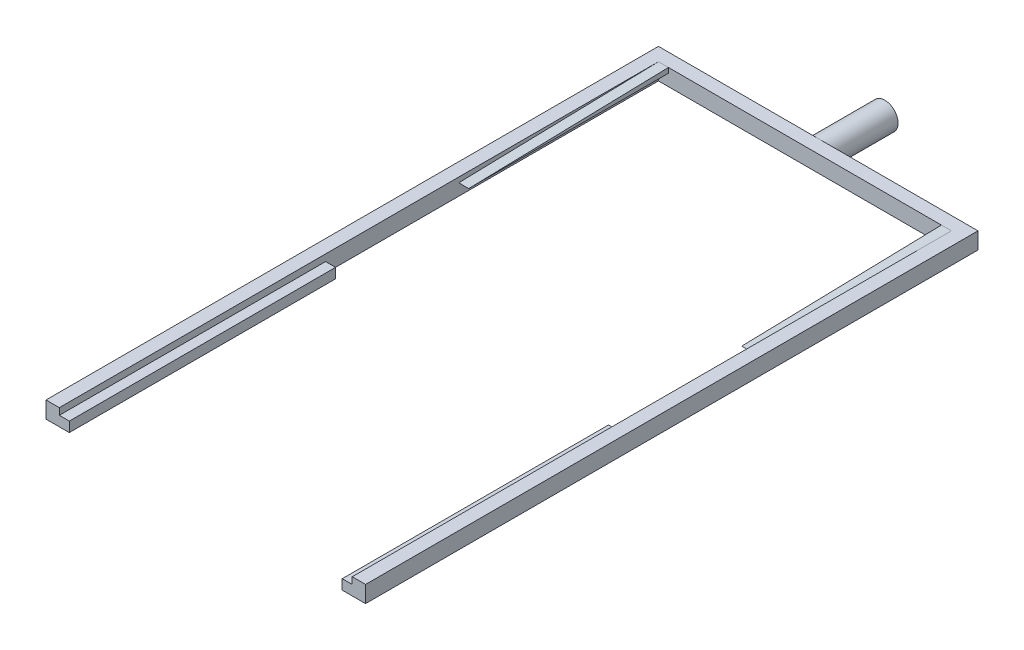
ISO-10303-21;
HEADER;
FILE_DESCRIPTION(('STEP AP214'),'2;1');
FILE_NAME('part.step','',(''),(''),'','','');
FILE_SCHEMA(('AUTOMOTIVE_DESIGN { 1 0 10303 214 1 1 1 1 }'));
ENDSEC;
DATA;
#1=APPLICATION_CONTEXT('core data for automotive mechanical design processes');
#2=APPLICATION_PROTOCOL_DEFINITION('international standard','automotive_design',2000,#1);
#3=PRODUCT_CONTEXT('',#1,'mechanical');
#4=PRODUCT('Part','Part','',(#3));
#5=PRODUCT_RELATED_PRODUCT_CATEGORY('part','',(#4));
#6=PRODUCT_DEFINITION_FORMATION('','',#4);
#7=PRODUCT_DEFINITION_CONTEXT('part definition',#1,'design');
#8=PRODUCT_DEFINITION('design','',#6,#7);
#9=PRODUCT_DEFINITION_SHAPE('','',#8);
#10=(LENGTH_UNIT() NAMED_UNIT(*) SI_UNIT(.MILLI.,.METRE.));
#11=(NAMED_UNIT(*) PLANE_ANGLE_UNIT() SI_UNIT($,.RADIAN.));
#12=(NAMED_UNIT(*) SI_UNIT($,.STERADIAN.) SOLID_ANGLE_UNIT());
#13=UNCERTAINTY_MEASURE_WITH_UNIT(LENGTH_MEASURE(1.E-05),#10,'distance_accuracy_value','');
#14=(GEOMETRIC_REPRESENTATION_CONTEXT(3) GLOBAL_UNCERTAINTY_ASSIGNED_CONTEXT((#13)) GLOBAL_UNIT_ASSIGNED_CONTEXT((#10,
#11,#12)) REPRESENTATION_CONTEXT('',''));
#15=CARTESIAN_POINT('',(0.,0.,0.));
#16=DIRECTION('',(0.,0.,1.));
#17=DIRECTION('',(1.,0.,0.));
#18=AXIS2_PLACEMENT_3D('',#15,#16,#17);
#19=CARTESIAN_POINT('',(-24.,2.5,-47.));
#20=DIRECTION('',(0.,0.,-1.));
#21=DIRECTION('',(-1.,0.,0.));
#22=AXIS2_PLACEMENT_3D('',#19,#20,#21);
#23=PLANE('',#22);
#24=CARTESIAN_POINT('',(0.,0.5,-47.));
#25=DIRECTION('',(0.,0.,-1.));
#26=DIRECTION('',(-1.,0.,0.));
#27=AXIS2_PLACEMENT_3D('',#24,#25,#26);
#28=CIRCLE('',#27,2.);
#29=CARTESIAN_POINT('',(0.,2.5,-47.));
#30=VERTEX_POINT('',#29);
#31=CARTESIAN_POINT('',(1.93649167310371,0.,-47.));
#32=VERTEX_POINT('',#31);
#33=EDGE_CURVE('E53',#30,#32,#28,.T.);
#34=ORIENTED_EDGE('',*,*,#33,.F.);
#35=DIRECTION('',(1.,0.,0.));
#36=VECTOR('',#35,1.);
#37=CARTESIAN_POINT('',(-24.,2.5,-47.));
#38=LINE('',#37,#36);
#39=CARTESIAN_POINT('',(24.,2.5,-47.));
#40=VERTEX_POINT('',#39);
#41=EDGE_CURVE('E192',#30,#40,#38,.T.);
#42=ORIENTED_EDGE('',*,*,#41,.T.);
#43=DIRECTION('',(0.,-1.,0.));
#44=VECTOR('',#43,1.);
#45=CARTESIAN_POINT('',(24.,2.5,-47.));
#46=LINE('',#45,#44);
#47=CARTESIAN_POINT('',(24.,0.,-47.));
#48=VERTEX_POINT('',#47);
#49=EDGE_CURVE('E336',#40,#48,#46,.T.);
#50=ORIENTED_EDGE('',*,*,#49,.T.);
#51=DIRECTION('',(1.,0.,0.));
#52=VECTOR('',#51,1.);
#53=CARTESIAN_POINT('',(-24.,0.,-47.));
#54=LINE('',#53,#52);
#55=EDGE_CURVE('E61',#32,#48,#54,.T.);
#56=ORIENTED_EDGE('',*,*,#55,.F.);
#57=EDGE_LOOP('',(#34,#42,#50,#56));
#58=FACE_BOUND('',#57,.T.);
#59=ADVANCED_FACE('F43',(#58),#23,.T.);
#60=CARTESIAN_POINT('',(-22.,2.5,45.));
#61=DIRECTION('',(-1.,0.,0.));
#62=DIRECTION('',(0.,0.,1.));
#63=AXIS2_PLACEMENT_3D('',#60,#61,#62);
#64=PLANE('',#63);
#65=DIRECTION('',(0.,1.,0.));
#66=VECTOR('',#65,1.);
#67=CARTESIAN_POINT('',(-22.,0.,5.00000000000001));
#68=LINE('',#67,#66);
#69=CARTESIAN_POINT('',(-22.,0.,5.00000000000001));
#70=VERTEX_POINT('',#69);
#71=CARTESIAN_POINT('',(-22.,1.5,5.00000000000001));
#72=VERTEX_POINT('',#71);
#73=EDGE_CURVE('E270',#70,#72,#68,.T.);
#74=ORIENTED_EDGE('',*,*,#73,.F.);
#75=DIRECTION('',(0.,0.,-1.));
#76=VECTOR('',#75,1.);
#77=CARTESIAN_POINT('',(-22.,0.,45.));
#78=LINE('',#77,#76);
#79=CARTESIAN_POINT('',(-22.,0.,-45.));
#80=VERTEX_POINT('',#79);
#81=EDGE_CURVE('E317',#70,#80,#78,.T.);
#82=ORIENTED_EDGE('',*,*,#81,.T.);
#83=DIRECTION('',(0.,-1.,0.));
#84=VECTOR('',#83,1.);
#85=CARTESIAN_POINT('',(-22.,2.5,-45.));
#86=LINE('',#85,#84);
#87=CARTESIAN_POINT('',(-22.,1.75000000000001,-45.));
#88=VERTEX_POINT('',#87);
#89=EDGE_CURVE('E346',#88,#80,#86,.T.);
#90=ORIENTED_EDGE('',*,*,#89,.F.);
#91=DIRECTION('',(0.,0.,-1.));
#92=VECTOR('',#91,1.);
#93=CARTESIAN_POINT('',(-22.,1.75000000000001,-45.));
#94=LINE('',#93,#92);
#95=CARTESIAN_POINT('',(-22.,1.75,-15.));
#96=VERTEX_POINT('',#95);
#97=EDGE_CURVE('E285',#96,#88,#94,.T.);
#98=ORIENTED_EDGE('',*,*,#97,.F.);
#99=DIRECTION('',(0.,-0.024992191160203,0.999687646408123));
#100=VECTOR('',#99,1.);
#101=CARTESIAN_POINT('',(-22.,1.75,-15.));
#102=LINE('',#101,#100);
#103=CARTESIAN_POINT('',(-22.,2.5,-45.));
#104=VERTEX_POINT('',#103);
#105=EDGE_CURVE('E274',#104,#96,#102,.T.);
#106=ORIENTED_EDGE('',*,*,#105,.F.);
#107=DIRECTION('',(0.,0.,-1.));
#108=VECTOR('',#107,1.);
#109=CARTESIAN_POINT('',(-22.,2.5,45.));
#110=LINE('',#109,#108);
#111=CARTESIAN_POINT('',(-22.,2.5,45.));
#112=VERTEX_POINT('',#111);
#113=EDGE_CURVE('E300',#112,#104,#110,.T.);
#114=ORIENTED_EDGE('',*,*,#113,.F.);
#115=DIRECTION('',(0.,-1.,0.));
#116=VECTOR('',#115,1.);
#117=CARTESIAN_POINT('',(-22.,2.5,45.));
#118=LINE('',#117,#116);
#119=CARTESIAN_POINT('',(-22.,1.5,45.));
#120=VERTEX_POINT('',#119);
#121=EDGE_CURVE('E47',#112,#120,#118,.T.);
#122=ORIENTED_EDGE('',*,*,#121,.T.);
#123=DIRECTION('',(0.,0.,1.));
#124=VECTOR('',#123,1.);
#125=CARTESIAN_POINT('',(-22.,1.5,5.00000000000001));
#126=LINE('',#125,#124);
#127=EDGE_CURVE('E267',#72,#120,#126,.T.);
#128=ORIENTED_EDGE('',*,*,#127,.F.);
#129=EDGE_LOOP('',(#74,#82,#90,#98,#106,#114,#122,#128));
#130=FACE_BOUND('',#129,.T.);
#131=ADVANCED_FACE('F354',(#130),#64,.F.);
#132=CARTESIAN_POINT('',(-22.,2.5,-45.));
#133=DIRECTION('',(0.,0.,-1.));
#134=DIRECTION('',(-1.,0.,0.));
#135=AXIS2_PLACEMENT_3D('',#132,#133,#134);
#136=PLANE('',#135);
#137=DIRECTION('',(0.,-1.,0.));
#138=VECTOR('',#137,1.);
#139=CARTESIAN_POINT('',(22.,2.5,-45.));
#140=LINE('',#139,#138);
#141=CARTESIAN_POINT('',(22.,1.75000000000001,-45.));
#142=VERTEX_POINT('',#141);
#143=CARTESIAN_POINT('',(22.,0.,-45.));
#144=VERTEX_POINT('',#143);
#145=EDGE_CURVE('E344',#142,#144,#140,.T.);
#146=ORIENTED_EDGE('',*,*,#145,.F.);
#147=DIRECTION('',(1.,0.,0.));
#148=VECTOR('',#147,1.);
#149=CARTESIAN_POINT('',(20.5,1.75000000000001,-45.));
#150=LINE('',#149,#148);
#151=CARTESIAN_POINT('',(20.5,1.75000000000001,-45.));
#152=VERTEX_POINT('',#151);
#153=EDGE_CURVE('E255',#152,#142,#150,.T.);
#154=ORIENTED_EDGE('',*,*,#153,.F.);
#155=DIRECTION('',(0.,1.,0.));
#156=VECTOR('',#155,1.);
#157=CARTESIAN_POINT('',(20.5,2.5,-45.));
#158=LINE('',#157,#156);
#159=CARTESIAN_POINT('',(20.5,2.5,-45.));
#160=VERTEX_POINT('',#159);
#161=EDGE_CURVE('E236',#152,#160,#158,.T.);
#162=ORIENTED_EDGE('',*,*,#161,.T.);
#163=DIRECTION('',(1.,0.,0.));
#164=VECTOR('',#163,1.);
#165=CARTESIAN_POINT('',(-22.,2.5,-45.));
#166=LINE('',#165,#164);
#167=CARTESIAN_POINT('',(-20.5,2.5,-45.));
#168=VERTEX_POINT('',#167);
#169=EDGE_CURVE('E304',#168,#160,#166,.T.);
#170=ORIENTED_EDGE('',*,*,#169,.F.);
#171=DIRECTION('',(0.,1.,0.));
#172=VECTOR('',#171,1.);
#173=CARTESIAN_POINT('',(-20.5,2.5,-45.));
#174=LINE('',#173,#172);
#175=CARTESIAN_POINT('',(-20.5,1.75000000000001,-45.));
#176=VERTEX_POINT('',#175);
#177=EDGE_CURVE('E282',#176,#168,#174,.T.);
#178=ORIENTED_EDGE('',*,*,#177,.F.);
#179=DIRECTION('',(-1.,0.,0.));
#180=VECTOR('',#179,1.);
#181=CARTESIAN_POINT('',(-20.5,1.75000000000001,-45.));
#182=LINE('',#181,#180);
#183=EDGE_CURVE('E289',#176,#88,#182,.T.);
#184=ORIENTED_EDGE('',*,*,#183,.T.);
#185=ORIENTED_EDGE('',*,*,#89,.T.);
#186=DIRECTION('',(1.,0.,0.));
#187=VECTOR('',#186,1.);
#188=CARTESIAN_POINT('',(-22.,0.,-45.));
#189=LINE('',#188,#187);
#190=EDGE_CURVE('E319',#80,#144,#189,.T.);
#191=ORIENTED_EDGE('',*,*,#190,.T.);
#192=EDGE_LOOP('',(#146,#154,#162,#170,#178,#184,#185,#191));
#193=FACE_BOUND('',#192,.T.);
#194=ADVANCED_FACE('F377',(#193),#136,.F.);
#195=CARTESIAN_POINT('',(-24.,2.5,45.));
#196=DIRECTION('',(0.,0.,-1.));
#197=DIRECTION('',(-1.,0.,0.));
#198=AXIS2_PLACEMENT_3D('',#195,#196,#197);
#199=PLANE('',#198);
#200=DIRECTION('',(1.,0.,0.));
#201=VECTOR('',#200,1.);
#202=CARTESIAN_POINT('',(-24.,0.,45.));
#203=LINE('',#202,#201);
#204=CARTESIAN_POINT('',(-24.,0.,45.));
#205=VERTEX_POINT('',#204);
#206=CARTESIAN_POINT('',(-20.5,0.,45.));
#207=VERTEX_POINT('',#206);
#208=EDGE_CURVE('E297',#205,#207,#203,.T.);
#209=ORIENTED_EDGE('',*,*,#208,.T.);
#210=DIRECTION('',(0.,-1.,0.));
#211=VECTOR('',#210,1.);
#212=CARTESIAN_POINT('',(-20.5,1.5,45.));
#213=LINE('',#212,#211);
#214=CARTESIAN_POINT('',(-20.5,1.5,45.));
#215=VERTEX_POINT('',#214);
#216=EDGE_CURVE('E271',#215,#207,#213,.T.);
#217=ORIENTED_EDGE('',*,*,#216,.F.);
#218=DIRECTION('',(-1.,0.,0.));
#219=VECTOR('',#218,1.);
#220=CARTESIAN_POINT('',(-20.5,1.5,45.));
#221=LINE('',#220,#219);
#222=EDGE_CURVE('E263',#215,#120,#221,.T.);
#223=ORIENTED_EDGE('',*,*,#222,.T.);
#224=ORIENTED_EDGE('',*,*,#121,.F.);
#225=DIRECTION('',(1.,0.,0.));
#226=VECTOR('',#225,1.);
#227=CARTESIAN_POINT('',(-24.,2.5,45.));
#228=LINE('',#227,#226);
#229=CARTESIAN_POINT('',(-24.,2.5,45.));
#230=VERTEX_POINT('',#229);
#231=EDGE_CURVE('E298',#230,#112,#228,.T.);
#232=ORIENTED_EDGE('',*,*,#231,.F.);
#233=DIRECTION('',(0.,-1.,0.));
#234=VECTOR('',#233,1.);
#235=CARTESIAN_POINT('',(-24.,2.5,45.));
#236=LINE('',#235,#234);
#237=EDGE_CURVE('E315',#230,#205,#236,.T.);
#238=ORIENTED_EDGE('',*,*,#237,.T.);
#239=EDGE_LOOP('',(#209,#217,#223,#224,#232,#238));
#240=FACE_BOUND('',#239,.T.);
#241=ADVANCED_FACE('F45',(#240),#199,.F.);
#242=CARTESIAN_POINT('',(22.,2.5,45.));
#243=DIRECTION('',(-1.,0.,0.));
#244=DIRECTION('',(0.,0.,1.));
#245=AXIS2_PLACEMENT_3D('',#242,#243,#244);
#246=PLANE('',#245);
#247=DIRECTION('',(0.,0.,1.));
#248=VECTOR('',#247,1.);
#249=CARTESIAN_POINT('',(22.,1.5,5.00000000000001));
#250=LINE('',#249,#248);
#251=CARTESIAN_POINT('',(22.,1.5,5.00000000000001));
#252=VERTEX_POINT('',#251);
#253=CARTESIAN_POINT('',(22.,1.5,45.));
#254=VERTEX_POINT('',#253);
#255=EDGE_CURVE('E224',#252,#254,#250,.T.);
#256=ORIENTED_EDGE('',*,*,#255,.T.);
#257=DIRECTION('',(0.,-1.,0.));
#258=VECTOR('',#257,1.);
#259=CARTESIAN_POINT('',(22.,2.5,45.));
#260=LINE('',#259,#258);
#261=CARTESIAN_POINT('',(22.,2.5,45.));
#262=VERTEX_POINT('',#261);
#263=EDGE_CURVE('E341',#262,#254,#260,.T.);
#264=ORIENTED_EDGE('',*,*,#263,.F.);
#265=DIRECTION('',(0.,0.,-1.));
#266=VECTOR('',#265,1.);
#267=CARTESIAN_POINT('',(22.,2.5,45.));
#268=LINE('',#267,#266);
#269=CARTESIAN_POINT('',(22.,2.5,-45.));
#270=VERTEX_POINT('',#269);
#271=EDGE_CURVE('E308',#262,#270,#268,.T.);
#272=ORIENTED_EDGE('',*,*,#271,.T.);
#273=DIRECTION('',(0.,-0.024992191160203,0.999687646408123));
#274=VECTOR('',#273,1.);
#275=CARTESIAN_POINT('',(22.,1.75,-15.));
#276=LINE('',#275,#274);
#277=CARTESIAN_POINT('',(22.,1.75,-15.));
#278=VERTEX_POINT('',#277);
#279=EDGE_CURVE('E240',#270,#278,#276,.T.);
#280=ORIENTED_EDGE('',*,*,#279,.T.);
#281=DIRECTION('',(0.,0.,-1.));
#282=VECTOR('',#281,1.);
#283=CARTESIAN_POINT('',(22.,1.75000000000001,-45.));
#284=LINE('',#283,#282);
#285=EDGE_CURVE('E235',#278,#142,#284,.T.);
#286=ORIENTED_EDGE('',*,*,#285,.T.);
#287=ORIENTED_EDGE('',*,*,#145,.T.);
#288=DIRECTION('',(0.,0.,-1.));
#289=VECTOR('',#288,1.);
#290=CARTESIAN_POINT('',(22.,0.,45.));
#291=LINE('',#290,#289);
#292=CARTESIAN_POINT('',(22.,0.,5.00000000000002));
#293=VERTEX_POINT('',#292);
#294=EDGE_CURVE('E322',#293,#144,#291,.T.);
#295=ORIENTED_EDGE('',*,*,#294,.F.);
#296=DIRECTION('',(0.,1.,0.));
#297=VECTOR('',#296,1.);
#298=CARTESIAN_POINT('',(22.,0.,5.00000000000001));
#299=LINE('',#298,#297);
#300=EDGE_CURVE('E214',#293,#252,#299,.T.);
#301=ORIENTED_EDGE('',*,*,#300,.T.);
#302=EDGE_LOOP('',(#256,#264,#272,#280,#286,#287,#295,#301));
#303=FACE_BOUND('',#302,.T.);
#304=ADVANCED_FACE('F380',(#303),#246,.T.);
#305=CARTESIAN_POINT('',(22.,2.5,45.));
#306=DIRECTION('',(0.,0.,-1.));
#307=DIRECTION('',(-1.,0.,0.));
#308=AXIS2_PLACEMENT_3D('',#305,#306,#307);
#309=PLANE('',#308);
#310=DIRECTION('',(1.,0.,0.));
#311=VECTOR('',#310,1.);
#312=CARTESIAN_POINT('',(22.,0.,45.));
#313=LINE('',#312,#311);
#314=CARTESIAN_POINT('',(20.5,0.,45.));
#315=VERTEX_POINT('',#314);
#316=CARTESIAN_POINT('',(24.,0.,45.));
#317=VERTEX_POINT('',#316);
#318=EDGE_CURVE('E324',#315,#317,#313,.T.);
#319=ORIENTED_EDGE('',*,*,#318,.T.);
#320=DIRECTION('',(0.,-1.,0.));
#321=VECTOR('',#320,1.);
#322=CARTESIAN_POINT('',(24.,2.5,45.));
#323=LINE('',#322,#321);
#324=CARTESIAN_POINT('',(24.,2.5,45.));
#325=VERTEX_POINT('',#324);
#326=EDGE_CURVE('E338',#325,#317,#323,.T.);
#327=ORIENTED_EDGE('',*,*,#326,.F.);
#328=DIRECTION('',(1.,0.,0.));
#329=VECTOR('',#328,1.);
#330=CARTESIAN_POINT('',(22.,2.5,45.));
#331=LINE('',#330,#329);
#332=EDGE_CURVE('E311',#262,#325,#331,.T.);
#333=ORIENTED_EDGE('',*,*,#332,.F.);
#334=ORIENTED_EDGE('',*,*,#263,.T.);
#335=DIRECTION('',(1.,0.,0.));
#336=VECTOR('',#335,1.);
#337=CARTESIAN_POINT('',(20.5,1.5,45.));
#338=LINE('',#337,#336);
#339=CARTESIAN_POINT('',(20.5,1.5,45.));
#340=VERTEX_POINT('',#339);
#341=EDGE_CURVE('E233',#340,#254,#338,.T.);
#342=ORIENTED_EDGE('',*,*,#341,.F.);
#343=DIRECTION('',(0.,-1.,0.));
#344=VECTOR('',#343,1.);
#345=CARTESIAN_POINT('',(20.5,1.5,45.));
#346=LINE('',#345,#344);
#347=EDGE_CURVE('E210',#340,#315,#346,.T.);
#348=ORIENTED_EDGE('',*,*,#347,.T.);
#349=EDGE_LOOP('',(#319,#327,#333,#334,#342,#348));
#350=FACE_BOUND('',#349,.T.);
#351=ADVANCED_FACE('F397',(#350),#309,.F.);
#352=CARTESIAN_POINT('',(24.,2.5,45.));
#353=DIRECTION('',(-1.,0.,0.));
#354=DIRECTION('',(0.,0.,1.));
#355=AXIS2_PLACEMENT_3D('',#352,#353,#354);
#356=PLANE('',#355);
#357=DIRECTION('',(0.,0.,-1.));
#358=VECTOR('',#357,1.);
#359=CARTESIAN_POINT('',(24.,0.,45.));
#360=LINE('',#359,#358);
#361=EDGE_CURVE('E326',#317,#48,#360,.T.);
#362=ORIENTED_EDGE('',*,*,#361,.T.);
#363=ORIENTED_EDGE('',*,*,#49,.F.);
#364=DIRECTION('',(0.,0.,-1.));
#365=VECTOR('',#364,1.);
#366=CARTESIAN_POINT('',(24.,2.5,45.));
#367=LINE('',#366,#365);
#368=EDGE_CURVE('E198',#325,#40,#367,.T.);
#369=ORIENTED_EDGE('',*,*,#368,.F.);
#370=ORIENTED_EDGE('',*,*,#326,.T.);
#371=EDGE_LOOP('',(#362,#363,#369,#370));
#372=FACE_BOUND('',#371,.T.);
#373=ADVANCED_FACE('F400',(#372),#356,.F.);
#374=CARTESIAN_POINT('',(-1.93649167310371,0.,-47.));
#375=VERTEX_POINT('',#374);
#376=EDGE_CURVE('E11',#375,#30,#28,.T.);
#377=ORIENTED_EDGE('',*,*,#376,.F.);
#378=CARTESIAN_POINT('',(-24.,0.,-47.));
#379=VERTEX_POINT('',#378);
#380=EDGE_CURVE('E329',#379,#375,#54,.T.);
#381=ORIENTED_EDGE('',*,*,#380,.F.);
#382=DIRECTION('',(0.,-1.,0.));
#383=VECTOR('',#382,1.);
#384=CARTESIAN_POINT('',(-24.,2.5,-47.));
#385=LINE('',#384,#383);
#386=CARTESIAN_POINT('',(-24.,2.5,-47.));
#387=VERTEX_POINT('',#386);
#388=EDGE_CURVE('E187',#387,#379,#385,.T.);
#389=ORIENTED_EDGE('',*,*,#388,.F.);
#390=EDGE_CURVE('E184',#387,#30,#38,.T.);
#391=ORIENTED_EDGE('',*,*,#390,.T.);
#392=EDGE_LOOP('',(#377,#381,#389,#391));
#393=FACE_BOUND('',#392,.T.);
#394=ADVANCED_FACE('F186',(#393),#23,.T.);
#395=CARTESIAN_POINT('',(-24.,2.5,45.));
#396=DIRECTION('',(-1.,0.,0.));
#397=DIRECTION('',(0.,0.,1.));
#398=AXIS2_PLACEMENT_3D('',#395,#396,#397);
#399=PLANE('',#398);
#400=DIRECTION('',(0.,0.,-1.));
#401=VECTOR('',#400,1.);
#402=CARTESIAN_POINT('',(-24.,0.,45.));
#403=LINE('',#402,#401);
#404=EDGE_CURVE('E301',#205,#379,#403,.T.);
#405=ORIENTED_EDGE('',*,*,#404,.F.);
#406=ORIENTED_EDGE('',*,*,#237,.F.);
#407=DIRECTION('',(0.,0.,-1.));
#408=VECTOR('',#407,1.);
#409=CARTESIAN_POINT('',(-24.,2.5,45.));
#410=LINE('',#409,#408);
#411=EDGE_CURVE('E191',#230,#387,#410,.T.);
#412=ORIENTED_EDGE('',*,*,#411,.T.);
#413=ORIENTED_EDGE('',*,*,#388,.T.);
#414=EDGE_LOOP('',(#405,#406,#412,#413));
#415=FACE_BOUND('',#414,.T.);
#416=ADVANCED_FACE('F420',(#415),#399,.T.);
#417=CARTESIAN_POINT('',(0.,2.5,0.));
#418=DIRECTION('',(0.,1.,0.));
#419=DIRECTION('',(0.,0.,1.));
#420=AXIS2_PLACEMENT_3D('',#417,#418,#419);
#421=PLANE('',#420);
#422=ORIENTED_EDGE('',*,*,#231,.T.);
#423=ORIENTED_EDGE('',*,*,#113,.T.);
#424=EDGE_CURVE('E305',#104,#168,#166,.T.);
#425=ORIENTED_EDGE('',*,*,#424,.T.);
#426=ORIENTED_EDGE('',*,*,#169,.T.);
#427=DIRECTION('',(1.,0.,0.));
#428=VECTOR('',#427,1.);
#429=CARTESIAN_POINT('',(20.5,2.5,-45.));
#430=LINE('',#429,#428);
#431=EDGE_CURVE('E246',#160,#270,#430,.T.);
#432=ORIENTED_EDGE('',*,*,#431,.T.);
#433=ORIENTED_EDGE('',*,*,#271,.F.);
#434=ORIENTED_EDGE('',*,*,#332,.T.);
#435=ORIENTED_EDGE('',*,*,#368,.T.);
#436=ORIENTED_EDGE('',*,*,#41,.F.);
#437=ORIENTED_EDGE('',*,*,#390,.F.);
#438=ORIENTED_EDGE('',*,*,#411,.F.);
#439=EDGE_LOOP('',(#422,#423,#425,#426,#432,#433,#434,#435,#436,#437,#438));
#440=FACE_BOUND('',#439,.T.);
#441=ADVANCED_FACE('F196',(#440),#421,.T.);
#442=CARTESIAN_POINT('',(0.,0.,0.));
#443=DIRECTION('',(0.,1.,0.));
#444=DIRECTION('',(0.,0.,1.));
#445=AXIS2_PLACEMENT_3D('',#442,#443,#444);
#446=PLANE('',#445);
#447=ORIENTED_EDGE('',*,*,#208,.F.);
#448=ORIENTED_EDGE('',*,*,#404,.T.);
#449=ORIENTED_EDGE('',*,*,#380,.T.);
#450=EDGE_CURVE('E331',#375,#32,#54,.T.);
#451=ORIENTED_EDGE('',*,*,#450,.T.);
#452=ORIENTED_EDGE('',*,*,#55,.T.);
#453=ORIENTED_EDGE('',*,*,#361,.F.);
#454=ORIENTED_EDGE('',*,*,#318,.F.);
#455=DIRECTION('',(0.,0.,-1.));
#456=VECTOR('',#455,1.);
#457=CARTESIAN_POINT('',(20.5,0.,45.));
#458=LINE('',#457,#456);
#459=CARTESIAN_POINT('',(20.5,0.,5.00000000000001));
#460=VERTEX_POINT('',#459);
#461=EDGE_CURVE('E220',#315,#460,#458,.T.);
#462=ORIENTED_EDGE('',*,*,#461,.T.);
#463=DIRECTION('',(1.,0.,0.));
#464=VECTOR('',#463,1.);
#465=CARTESIAN_POINT('',(20.5,0.,5.00000000000001));
#466=LINE('',#465,#464);
#467=EDGE_CURVE('E223',#460,#293,#466,.T.);
#468=ORIENTED_EDGE('',*,*,#467,.T.);
#469=ORIENTED_EDGE('',*,*,#294,.T.);
#470=ORIENTED_EDGE('',*,*,#190,.F.);
#471=ORIENTED_EDGE('',*,*,#81,.F.);
#472=DIRECTION('',(-1.,0.,0.));
#473=VECTOR('',#472,1.);
#474=CARTESIAN_POINT('',(-20.5,0.,5.00000000000001));
#475=LINE('',#474,#473);
#476=CARTESIAN_POINT('',(-20.5,0.,5.00000000000001));
#477=VERTEX_POINT('',#476);
#478=EDGE_CURVE('E257',#477,#70,#475,.T.);
#479=ORIENTED_EDGE('',*,*,#478,.F.);
#480=DIRECTION('',(0.,0.,-1.));
#481=VECTOR('',#480,1.);
#482=CARTESIAN_POINT('',(-20.5,0.,45.));
#483=LINE('',#482,#481);
#484=EDGE_CURVE('E278',#207,#477,#483,.T.);
#485=ORIENTED_EDGE('',*,*,#484,.F.);
#486=EDGE_LOOP('',(#447,#448,#449,#451,#452,#453,#454,#462,#468,#469,#470,#471,#479,#485));
#487=FACE_BOUND('',#486,.T.);
#488=ADVANCED_FACE('F374',(#487),#446,.F.);
#489=CARTESIAN_POINT('',(-20.5,1.75,-15.));
#490=DIRECTION('',(0.,-0.999687646408123,-0.024992191160203));
#491=DIRECTION('',(0.,0.024992191160203,-0.999687646408123));
#492=AXIS2_PLACEMENT_3D('',#489,#490,#491);
#493=PLANE('',#492);
#494=ORIENTED_EDGE('',*,*,#105,.T.);
#495=DIRECTION('',(-1.,0.,0.));
#496=VECTOR('',#495,1.);
#497=CARTESIAN_POINT('',(-20.5,1.75,-15.));
#498=LINE('',#497,#496);
#499=CARTESIAN_POINT('',(-20.5,1.75,-15.));
#500=VERTEX_POINT('',#499);
#501=EDGE_CURVE('E294',#500,#96,#498,.T.);
#502=ORIENTED_EDGE('',*,*,#501,.F.);
#503=DIRECTION('',(0.,-0.024992191160203,0.999687646408123));
#504=VECTOR('',#503,1.);
#505=CARTESIAN_POINT('',(-20.5,1.75,-15.));
#506=LINE('',#505,#504);
#507=EDGE_CURVE('E284',#168,#500,#506,.T.);
#508=ORIENTED_EDGE('',*,*,#507,.F.);
#509=ORIENTED_EDGE('',*,*,#424,.F.);
#510=EDGE_LOOP('',(#494,#502,#508,#509));
#511=FACE_BOUND('',#510,.T.);
#512=ADVANCED_FACE('F448',(#511),#493,.F.);
#513=CARTESIAN_POINT('',(-20.5,1.75000000000001,-45.));
#514=DIRECTION('',(0.,1.,0.));
#515=DIRECTION('',(0.,0.,1.));
#516=AXIS2_PLACEMENT_3D('',#513,#514,#515);
#517=PLANE('',#516);
#518=ORIENTED_EDGE('',*,*,#97,.T.);
#519=ORIENTED_EDGE('',*,*,#183,.F.);
#520=DIRECTION('',(0.,0.,-1.));
#521=VECTOR('',#520,1.);
#522=CARTESIAN_POINT('',(-20.5,1.75000000000001,-45.));
#523=LINE('',#522,#521);
#524=EDGE_CURVE('E287',#500,#176,#523,.T.);
#525=ORIENTED_EDGE('',*,*,#524,.F.);
#526=ORIENTED_EDGE('',*,*,#501,.T.);
#527=EDGE_LOOP('',(#518,#519,#525,#526));
#528=FACE_BOUND('',#527,.T.);
#529=ADVANCED_FACE('F452',(#528),#517,.F.);
#530=CARTESIAN_POINT('',(-20.5,0.,0.));
#531=DIRECTION('',(-1.,0.,0.));
#532=DIRECTION('',(0.,0.,1.));
#533=AXIS2_PLACEMENT_3D('',#530,#531,#532);
#534=PLANE('',#533);
#535=ORIENTED_EDGE('',*,*,#177,.T.);
#536=ORIENTED_EDGE('',*,*,#507,.T.);
#537=ORIENTED_EDGE('',*,*,#524,.T.);
#538=EDGE_LOOP('',(#535,#536,#537));
#539=FACE_BOUND('',#538,.T.);
#540=ADVANCED_FACE('F461',(#539),#534,.F.);
#541=CARTESIAN_POINT('',(-20.5,0.,5.00000000000001));
#542=DIRECTION('',(0.,0.,1.));
#543=DIRECTION('',(1.,0.,0.));
#544=AXIS2_PLACEMENT_3D('',#541,#542,#543);
#545=PLANE('',#544);
#546=ORIENTED_EDGE('',*,*,#73,.T.);
#547=DIRECTION('',(-1.,0.,0.));
#548=VECTOR('',#547,1.);
#549=CARTESIAN_POINT('',(-20.5,1.5,5.00000000000001));
#550=LINE('',#549,#548);
#551=CARTESIAN_POINT('',(-20.5,1.5,5.00000000000001));
#552=VERTEX_POINT('',#551);
#553=EDGE_CURVE('E260',#552,#72,#550,.T.);
#554=ORIENTED_EDGE('',*,*,#553,.F.);
#555=DIRECTION('',(0.,1.,0.));
#556=VECTOR('',#555,1.);
#557=CARTESIAN_POINT('',(-20.5,0.,5.00000000000001));
#558=LINE('',#557,#556);
#559=EDGE_CURVE('E276',#477,#552,#558,.T.);
#560=ORIENTED_EDGE('',*,*,#559,.F.);
#561=ORIENTED_EDGE('',*,*,#478,.T.);
#562=EDGE_LOOP('',(#546,#554,#560,#561));
#563=FACE_BOUND('',#562,.T.);
#564=ADVANCED_FACE('F371',(#563),#545,.F.);
#565=CARTESIAN_POINT('',(-20.5,1.5,5.00000000000001));
#566=DIRECTION('',(0.,-1.,0.));
#567=DIRECTION('',(0.,0.,-1.));
#568=AXIS2_PLACEMENT_3D('',#565,#566,#567);
#569=PLANE('',#568);
#570=ORIENTED_EDGE('',*,*,#127,.T.);
#571=ORIENTED_EDGE('',*,*,#222,.F.);
#572=DIRECTION('',(0.,0.,1.));
#573=VECTOR('',#572,1.);
#574=CARTESIAN_POINT('',(-20.5,1.5,5.00000000000001));
#575=LINE('',#574,#573);
#576=EDGE_CURVE('E266',#552,#215,#575,.T.);
#577=ORIENTED_EDGE('',*,*,#576,.F.);
#578=ORIENTED_EDGE('',*,*,#553,.T.);
#579=EDGE_LOOP('',(#570,#571,#577,#578));
#580=FACE_BOUND('',#579,.T.);
#581=ADVANCED_FACE('F360',(#580),#569,.F.);
#582=CARTESIAN_POINT('',(-20.5,0.,0.));
#583=DIRECTION('',(1.,0.,0.));
#584=DIRECTION('',(0.,0.,-1.));
#585=AXIS2_PLACEMENT_3D('',#582,#583,#584);
#586=PLANE('',#585);
#587=ORIENTED_EDGE('',*,*,#216,.T.);
#588=ORIENTED_EDGE('',*,*,#484,.T.);
#589=ORIENTED_EDGE('',*,*,#559,.T.);
#590=ORIENTED_EDGE('',*,*,#576,.T.);
#591=EDGE_LOOP('',(#587,#588,#589,#590));
#592=FACE_BOUND('',#591,.T.);
#593=ADVANCED_FACE('F367',(#592),#586,.T.);
#594=CARTESIAN_POINT('',(20.5,1.75000000000001,-45.));
#595=DIRECTION('',(0.,-1.,0.));
#596=DIRECTION('',(0.,0.,-1.));
#597=AXIS2_PLACEMENT_3D('',#594,#595,#596);
#598=PLANE('',#597);
#599=ORIENTED_EDGE('',*,*,#285,.F.);
#600=DIRECTION('',(1.,0.,0.));
#601=VECTOR('',#600,1.);
#602=CARTESIAN_POINT('',(20.5,1.75,-15.));
#603=LINE('',#602,#601);
#604=CARTESIAN_POINT('',(20.5,1.75,-15.));
#605=VERTEX_POINT('',#604);
#606=EDGE_CURVE('E253',#605,#278,#603,.T.);
#607=ORIENTED_EDGE('',*,*,#606,.F.);
#608=DIRECTION('',(0.,0.,-1.));
#609=VECTOR('',#608,1.);
#610=CARTESIAN_POINT('',(20.5,1.75000000000001,-45.));
#611=LINE('',#610,#609);
#612=EDGE_CURVE('E239',#605,#152,#611,.T.);
#613=ORIENTED_EDGE('',*,*,#612,.T.);
#614=ORIENTED_EDGE('',*,*,#153,.T.);
#615=EDGE_LOOP('',(#599,#607,#613,#614));
#616=FACE_BOUND('',#615,.T.);
#617=ADVANCED_FACE('F383',(#616),#598,.T.);
#618=CARTESIAN_POINT('',(20.5,1.75,-15.));
#619=DIRECTION('',(0.,0.999687646408123,0.024992191160203));
#620=DIRECTION('',(0.,-0.024992191160203,0.999687646408123));
#621=AXIS2_PLACEMENT_3D('',#618,#619,#620);
#622=PLANE('',#621);
#623=ORIENTED_EDGE('',*,*,#279,.F.);
#624=ORIENTED_EDGE('',*,*,#431,.F.);
#625=DIRECTION('',(0.,-0.024992191160203,0.999687646408123));
#626=VECTOR('',#625,1.);
#627=CARTESIAN_POINT('',(20.5,1.75,-15.));
#628=LINE('',#627,#626);
#629=EDGE_CURVE('E243',#160,#605,#628,.T.);
#630=ORIENTED_EDGE('',*,*,#629,.T.);
#631=ORIENTED_EDGE('',*,*,#606,.T.);
#632=EDGE_LOOP('',(#623,#624,#630,#631));
#633=FACE_BOUND('',#632,.T.);
#634=ADVANCED_FACE('F389',(#633),#622,.T.);
#635=CARTESIAN_POINT('',(20.5,0.,0.));
#636=DIRECTION('',(1.,0.,0.));
#637=DIRECTION('',(0.,0.,1.));
#638=AXIS2_PLACEMENT_3D('',#635,#636,#637);
#639=PLANE('',#638);
#640=ORIENTED_EDGE('',*,*,#161,.F.);
#641=ORIENTED_EDGE('',*,*,#612,.F.);
#642=ORIENTED_EDGE('',*,*,#629,.F.);
#643=EDGE_LOOP('',(#640,#641,#642));
#644=FACE_BOUND('',#643,.T.);
#645=ADVANCED_FACE('F387',(#644),#639,.F.);
#646=CARTESIAN_POINT('',(20.5,1.5,5.00000000000001));
#647=DIRECTION('',(0.,1.,0.));
#648=DIRECTION('',(0.,0.,1.));
#649=AXIS2_PLACEMENT_3D('',#646,#647,#648);
#650=PLANE('',#649);
#651=ORIENTED_EDGE('',*,*,#255,.F.);
#652=DIRECTION('',(1.,0.,0.));
#653=VECTOR('',#652,1.);
#654=CARTESIAN_POINT('',(20.5,1.5,5.00000000000001));
#655=LINE('',#654,#653);
#656=CARTESIAN_POINT('',(20.5,1.5,5.00000000000001));
#657=VERTEX_POINT('',#656);
#658=EDGE_CURVE('E231',#657,#252,#655,.T.);
#659=ORIENTED_EDGE('',*,*,#658,.F.);
#660=DIRECTION('',(0.,0.,1.));
#661=VECTOR('',#660,1.);
#662=CARTESIAN_POINT('',(20.5,1.5,5.00000000000001));
#663=LINE('',#662,#661);
#664=EDGE_CURVE('E213',#657,#340,#663,.T.);
#665=ORIENTED_EDGE('',*,*,#664,.T.);
#666=ORIENTED_EDGE('',*,*,#341,.T.);
#667=EDGE_LOOP('',(#651,#659,#665,#666));
#668=FACE_BOUND('',#667,.T.);
#669=ADVANCED_FACE('F536',(#668),#650,.T.);
#670=CARTESIAN_POINT('',(20.5,0.,5.00000000000001));
#671=DIRECTION('',(0.,0.,-1.));
#672=DIRECTION('',(-1.,0.,0.));
#673=AXIS2_PLACEMENT_3D('',#670,#671,#672);
#674=PLANE('',#673);
#675=ORIENTED_EDGE('',*,*,#300,.F.);
#676=ORIENTED_EDGE('',*,*,#467,.F.);
#677=DIRECTION('',(0.,1.,0.));
#678=VECTOR('',#677,1.);
#679=CARTESIAN_POINT('',(20.5,0.,5.00000000000001));
#680=LINE('',#679,#678);
#681=EDGE_CURVE('E217',#460,#657,#680,.T.);
#682=ORIENTED_EDGE('',*,*,#681,.T.);
#683=ORIENTED_EDGE('',*,*,#658,.T.);
#684=EDGE_LOOP('',(#675,#676,#682,#683));
#685=FACE_BOUND('',#684,.T.);
#686=ADVANCED_FACE('F545',(#685),#674,.T.);
#687=CARTESIAN_POINT('',(20.5,0.,0.));
#688=DIRECTION('',(-1.,0.,0.));
#689=DIRECTION('',(0.,0.,-1.));
#690=AXIS2_PLACEMENT_3D('',#687,#688,#689);
#691=PLANE('',#690);
#692=ORIENTED_EDGE('',*,*,#347,.F.);
#693=ORIENTED_EDGE('',*,*,#664,.F.);
#694=ORIENTED_EDGE('',*,*,#681,.F.);
#695=ORIENTED_EDGE('',*,*,#461,.F.);
#696=EDGE_LOOP('',(#692,#693,#694,#695));
#697=FACE_BOUND('',#696,.T.);
#698=ADVANCED_FACE('F555',(#697),#691,.T.);
#699=CARTESIAN_POINT('',(0.,0.5,-57.));
#700=DIRECTION('',(0.,0.,1.));
#701=DIRECTION('',(1.,0.,0.));
#702=AXIS2_PLACEMENT_3D('',#699,#700,#701);
#703=CYLINDRICAL_SURFACE('',#702,2.);
#704=CARTESIAN_POINT('',(0.,0.5,-57.));
#705=DIRECTION('',(0.,0.,-1.));
#706=DIRECTION('',(-1.,0.,0.));
#707=AXIS2_PLACEMENT_3D('',#704,#705,#706);
#708=CIRCLE('',#707,2.);
#709=CARTESIAN_POINT('',(-2.,0.5,-57.));
#710=VERTEX_POINT('',#709);
#711=EDGE_CURVE('E203',#710,#710,#708,.T.);
#712=ORIENTED_EDGE('',*,*,#711,.F.);
#713=EDGE_LOOP('',(#712));
#714=FACE_BOUND('',#713,.T.);
#715=ORIENTED_EDGE('',*,*,#33,.T.);
#716=EDGE_CURVE('E54',#32,#375,#28,.T.);
#717=ORIENTED_EDGE('',*,*,#716,.T.);
#718=ORIENTED_EDGE('',*,*,#376,.T.);
#719=EDGE_LOOP('',(#715,#717,#718));
#720=FACE_BOUND('',#719,.T.);
#721=ADVANCED_FACE('F204',(#714,#720),#703,.T.);
#722=CARTESIAN_POINT('',(0.,0.5,-57.));
#723=DIRECTION('',(0.,0.,-1.));
#724=DIRECTION('',(-1.,0.,0.));
#725=AXIS2_PLACEMENT_3D('',#722,#723,#724);
#726=PLANE('',#725);
#727=ORIENTED_EDGE('',*,*,#711,.T.);
#728=EDGE_LOOP('',(#727));
#729=FACE_BOUND('',#728,.T.);
#730=ADVANCED_FACE('F403',(#729),#726,.T.);
#731=CARTESIAN_POINT('',(0.,0.5,-47.));
#732=DIRECTION('',(0.,0.,-1.));
#733=DIRECTION('',(-1.,0.,0.));
#734=AXIS2_PLACEMENT_3D('',#731,#732,#733);
#735=PLANE('',#734);
#736=ORIENTED_EDGE('',*,*,#450,.F.);
#737=ORIENTED_EDGE('',*,*,#716,.F.);
#738=EDGE_LOOP('',(#736,#737));
#739=FACE_BOUND('',#738,.T.);
#740=ADVANCED_FACE('F401',(#739),#735,.F.);
#741=CLOSED_SHELL('',(#59,#131,#194,#241,#304,#351,#373,#394,#416,#441,#488,#512,#529,#540,#564,
#581,#593,#617,#634,#645,#669,#686,#698,#721,#730,#740));
#742=MANIFOLD_SOLID_BREP('B2',#741);
#743=ADVANCED_BREP_SHAPE_REPRESENTATION('',(#18,#742),#14);
#744=SHAPE_DEFINITION_REPRESENTATION(#9,#743);
ENDSEC;
END-ISO-10303-21;
